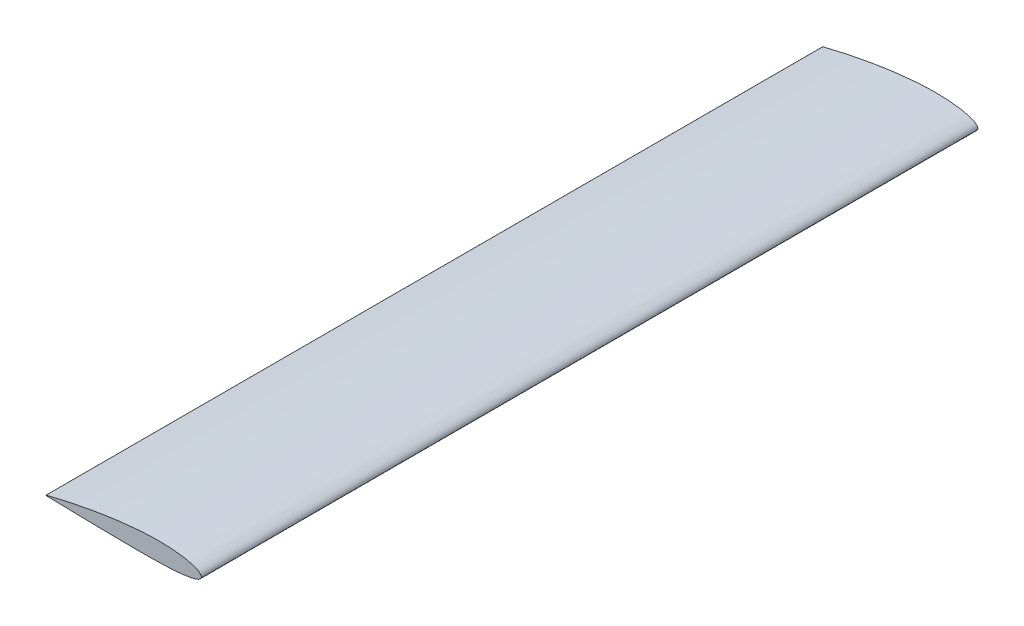
ISO-10303-21;
HEADER;
FILE_DESCRIPTION(('STEP AP214'),'2;1');
FILE_NAME('part.step','',(''),(''),'','','');
FILE_SCHEMA(('AUTOMOTIVE_DESIGN { 1 0 10303 214 1 1 1 1 }'));
ENDSEC;
DATA;
#1=APPLICATION_CONTEXT('core data for automotive mechanical design processes');
#2=APPLICATION_PROTOCOL_DEFINITION('international standard','automotive_design',2000,#1);
#3=PRODUCT_CONTEXT('',#1,'mechanical');
#4=PRODUCT('Part','Part','',(#3));
#5=PRODUCT_RELATED_PRODUCT_CATEGORY('part','',(#4));
#6=PRODUCT_DEFINITION_FORMATION('','',#4);
#7=PRODUCT_DEFINITION_CONTEXT('part definition',#1,'design');
#8=PRODUCT_DEFINITION('design','',#6,#7);
#9=PRODUCT_DEFINITION_SHAPE('','',#8);
#10=(LENGTH_UNIT() NAMED_UNIT(*) SI_UNIT(.MILLI.,.METRE.));
#11=(NAMED_UNIT(*) PLANE_ANGLE_UNIT() SI_UNIT($,.RADIAN.));
#12=(NAMED_UNIT(*) SI_UNIT($,.STERADIAN.) SOLID_ANGLE_UNIT());
#13=UNCERTAINTY_MEASURE_WITH_UNIT(LENGTH_MEASURE(1.E-05),#10,'distance_accuracy_value','');
#14=(GEOMETRIC_REPRESENTATION_CONTEXT(3) GLOBAL_UNCERTAINTY_ASSIGNED_CONTEXT((#13)) GLOBAL_UNIT_ASSIGNED_CONTEXT((#10,
#11,#12)) REPRESENTATION_CONTEXT('',''));
#15=CARTESIAN_POINT('',(0.,0.,0.));
#16=DIRECTION('',(0.,0.,1.));
#17=DIRECTION('',(1.,0.,0.));
#18=AXIS2_PLACEMENT_3D('',#15,#16,#17);
#19=CARTESIAN_POINT('',(-21.5149880919619,1.49289505253575,200.));
#20=CARTESIAN_POINT('',(-20.8552808528528,1.65836191019101,200.));
#21=CARTESIAN_POINT('',(-19.5375990437692,1.98886103982463,200.));
#22=CARTESIAN_POINT('',(-16.8979493866455,2.60408897384956,200.));
#23=CARTESIAN_POINT('',(-13.5935007095323,3.30234073325566,200.));
#24=CARTESIAN_POINT('',(-9.62153504880932,4.04911257775483,200.));
#25=CARTESIAN_POINT('',(-5.6460802092507,4.70083913196117,200.));
#26=CARTESIAN_POINT('',(-1.66331299768527,5.22484234700308,200.));
#27=CARTESIAN_POINT('',(2.32346877988122,5.63600355277235,200.));
#28=CARTESIAN_POINT('',(5.656633007237,5.82166566999899,200.));
#29=CARTESIAN_POINT('',(8.32675259810717,5.82769469753375,200.));
#30=CARTESIAN_POINT('',(10.3344227479367,5.75336243791782,200.));
#31=CARTESIAN_POINT('',(12.3487381124399,5.58478917604125,200.));
#32=CARTESIAN_POINT('',(14.0296115521638,5.34229294842828,200.));
#33=CARTESIAN_POINT('',(15.3742363976492,5.04362312569461,200.));
#34=CARTESIAN_POINT('',(16.3960036685772,4.76332551587091,200.));
#35=CARTESIAN_POINT('',(17.2661951421832,4.42275118989273,200.));
#36=CARTESIAN_POINT('',(18.0225851259267,3.99680442215517,200.));
#37=CARTESIAN_POINT('',(18.6993302032992,3.23262566509439,200.));
#38=CARTESIAN_POINT('',(18.062704035863,2.50715906463974,200.));
#39=CARTESIAN_POINT('',(17.3539555930788,2.15801290635164,200.));
#40=CARTESIAN_POINT('',(16.5145502138647,1.87965586102861,200.));
#41=CARTESIAN_POINT('',(15.5178113788948,1.66283214736944,200.));
#42=CARTESIAN_POINT('',(14.1898861783533,1.45695703477859,200.));
#43=CARTESIAN_POINT('',(12.5292288416715,1.27061703612148,200.));
#44=CARTESIAN_POINT('',(10.5312398266776,1.13774349447131,200.));
#45=CARTESIAN_POINT('',(8.53241217026352,1.05683280600654,200.));
#46=CARTESIAN_POINT('',(5.86546893621818,0.999315551548726,200.));
#47=CARTESIAN_POINT('',(2.53006814197317,0.959719147072521,200.));
#48=CARTESIAN_POINT('',(-1.47441513852983,0.969404554158539,200.));
#49=CARTESIAN_POINT('',(-5.4801499364741,1.03434695210018,200.));
#50=CARTESIAN_POINT('',(-9.48697437158574,1.10869611834631,200.));
#51=CARTESIAN_POINT('',(-13.4946147559285,1.18605498631132,200.));
#52=CARTESIAN_POINT('',(-16.8341832132715,1.27264683657346,200.));
#53=CARTESIAN_POINT('',(-19.5063687605127,1.33523150013912,200.));
#54=CARTESIAN_POINT('',(-20.842393454356,1.37107237127406,200.));
#55=CARTESIAN_POINT('',(-21.5104516756759,1.38899403749123,200.));
#56=B_SPLINE_CURVE_WITH_KNOTS('',3,(#19,#20,#21,#22,#23,#24,#25,#26,#27,#28,#29,#30,#31,#32,#33,
#34,#35,#36,#37,#38,#39,#40,#41,#42,#43,#44,#45,#46,#47,#48,#49,#50,#51,#52,#53,#54,#55),
.UNSPECIFIED.,.F.,.F.,(4,1,1,1,1,1,1,1,1,1,1,1,1,1,1,1,1,1,1,1,1,1,1,1,1,1,1,1,1,1,1,1,1,1,4),
(0.,0.0250124897498648,0.0499592861642578,0.0996729249269685,0.149206319909966,
0.198581096615965,0.247805170456832,0.296916574601493,0.345952721793533,0.37049162556991,
0.395091203654929,0.41981479582396,0.444798575016595,0.457489818915221,0.470406405435489,
0.483879408669829,0.491264120322896,0.503458853294664,0.513609129403887,0.520450990700287,
0.533235387615153,0.545691039147803,0.558031884237173,0.582609167247894,0.607134741746914,
0.631652079836766,0.656174271859652,0.705233949250519,0.754320378530032,0.803437363555032,
0.852566095729537,0.901700994033254,0.95084880933727,0.975422716989278,1.),.UNSPECIFIED.);
#57=DIRECTION('',(0.,0.,-1.));
#58=VECTOR('',#57,1.);
#59=SURFACE_OF_LINEAR_EXTRUSION('',#56,#58);
#60=CARTESIAN_POINT('',(-21.5149880919619,1.49289505253575,0.));
#61=CARTESIAN_POINT('',(-20.8552808528528,1.65836191019101,0.));
#62=CARTESIAN_POINT('',(-19.5375990437692,1.98886103982463,0.));
#63=CARTESIAN_POINT('',(-16.8979493866455,2.60408897384956,0.));
#64=CARTESIAN_POINT('',(-13.5935007095323,3.30234073325566,0.));
#65=CARTESIAN_POINT('',(-9.62153504880932,4.04911257775483,0.));
#66=CARTESIAN_POINT('',(-5.6460802092507,4.70083913196117,0.));
#67=CARTESIAN_POINT('',(-1.66331299768527,5.22484234700308,0.));
#68=CARTESIAN_POINT('',(2.32346877988122,5.63600355277235,0.));
#69=CARTESIAN_POINT('',(5.656633007237,5.82166566999899,0.));
#70=CARTESIAN_POINT('',(8.32675259810717,5.82769469753375,0.));
#71=CARTESIAN_POINT('',(10.3344227479367,5.75336243791782,0.));
#72=CARTESIAN_POINT('',(12.3487381124399,5.58478917604125,0.));
#73=CARTESIAN_POINT('',(14.0296115521638,5.34229294842828,0.));
#74=CARTESIAN_POINT('',(15.3742363976492,5.04362312569461,0.));
#75=CARTESIAN_POINT('',(16.3960036685772,4.76332551587091,0.));
#76=CARTESIAN_POINT('',(17.2661951421832,4.42275118989273,0.));
#77=CARTESIAN_POINT('',(18.0225851259267,3.99680442215517,0.));
#78=CARTESIAN_POINT('',(18.6993302032992,3.23262566509439,0.));
#79=CARTESIAN_POINT('',(18.062704035863,2.50715906463974,0.));
#80=CARTESIAN_POINT('',(17.3539555930788,2.15801290635164,0.));
#81=CARTESIAN_POINT('',(16.5145502138647,1.87965586102861,0.));
#82=CARTESIAN_POINT('',(15.5178113788948,1.66283214736944,0.));
#83=CARTESIAN_POINT('',(14.1898861783533,1.45695703477859,0.));
#84=CARTESIAN_POINT('',(12.5292288416715,1.27061703612148,0.));
#85=CARTESIAN_POINT('',(10.5312398266776,1.13774349447131,0.));
#86=CARTESIAN_POINT('',(8.53241217026352,1.05683280600654,0.));
#87=CARTESIAN_POINT('',(5.86546893621818,0.999315551548726,0.));
#88=CARTESIAN_POINT('',(2.53006814197317,0.959719147072521,0.));
#89=CARTESIAN_POINT('',(-1.47441513852983,0.969404554158539,0.));
#90=CARTESIAN_POINT('',(-5.4801499364741,1.03434695210018,0.));
#91=CARTESIAN_POINT('',(-9.48697437158574,1.10869611834631,0.));
#92=CARTESIAN_POINT('',(-13.4946147559285,1.18605498631132,0.));
#93=CARTESIAN_POINT('',(-16.8341832132715,1.27264683657346,0.));
#94=CARTESIAN_POINT('',(-19.5063687605127,1.33523150013912,0.));
#95=CARTESIAN_POINT('',(-20.842393454356,1.37107237127406,0.));
#96=CARTESIAN_POINT('',(-21.5104516756759,1.38899403749123,0.));
#97=B_SPLINE_CURVE_WITH_KNOTS('',3,(#60,#61,#62,#63,#64,#65,#66,#67,#68,#69,#70,#71,#72,#73,#74,
#75,#76,#77,#78,#79,#80,#81,#82,#83,#84,#85,#86,#87,#88,#89,#90,#91,#92,#93,#94,#95,#96),
.UNSPECIFIED.,.F.,.F.,(4,1,1,1,1,1,1,1,1,1,1,1,1,1,1,1,1,1,1,1,1,1,1,1,1,1,1,1,1,1,1,1,1,1,4),
(0.,0.0250124897498648,0.0499592861642578,0.0996729249269685,0.149206319909966,
0.198581096615965,0.247805170456832,0.296916574601493,0.345952721793533,0.37049162556991,
0.395091203654929,0.41981479582396,0.444798575016595,0.457489818915221,0.470406405435489,
0.483879408669829,0.491264120322896,0.503458853294664,0.513609129403887,0.520450990700287,
0.533235387615153,0.545691039147803,0.558031884237173,0.582609167247894,0.607134741746914,
0.631652079836766,0.656174271859652,0.705233949250519,0.754320378530032,0.803437363555032,
0.852566095729537,0.901700994033254,0.95084880933727,0.975422716989278,1.),.UNSPECIFIED.);
#98=CARTESIAN_POINT('',(-21.5149880919619,1.49289505253575,0.));
#99=VERTEX_POINT('',#98);
#100=CARTESIAN_POINT('',(-21.5104516756759,1.38899403749124,0.));
#101=VERTEX_POINT('',#100);
#102=EDGE_CURVE('E78',#99,#101,#97,.T.);
#103=ORIENTED_EDGE('',*,*,#102,.F.);
#104=DIRECTION('',(0.,0.,-1.));
#105=VECTOR('',#104,1.);
#106=CARTESIAN_POINT('',(-21.5149880919619,1.49289505253575,200.));
#107=LINE('',#106,#105);
#108=CARTESIAN_POINT('',(-21.5149880919619,1.49289505253575,200.));
#109=VERTEX_POINT('',#108);
#110=EDGE_CURVE('E11',#109,#99,#107,.T.);
#111=ORIENTED_EDGE('',*,*,#110,.F.);
#112=CARTESIAN_POINT('',(-21.5104516756759,1.38899403749124,200.));
#113=VERTEX_POINT('',#112);
#114=EDGE_CURVE('E80',#109,#113,#56,.T.);
#115=ORIENTED_EDGE('',*,*,#114,.T.);
#116=DIRECTION('',(0.,0.,-1.));
#117=VECTOR('',#116,1.);
#118=CARTESIAN_POINT('',(-21.5104516756759,1.38899403749124,200.));
#119=LINE('',#118,#117);
#120=EDGE_CURVE('E49',#113,#101,#119,.T.);
#121=ORIENTED_EDGE('',*,*,#120,.T.);
#122=EDGE_LOOP('',(#103,#111,#115,#121));
#123=FACE_BOUND('',#122,.T.);
#124=ADVANCED_FACE('F45',(#123),#59,.T.);
#125=CARTESIAN_POINT('',(-21.5018512212144,1.44141908107096,200.));
#126=DIRECTION('',(0.,0.,-1.));
#127=DIRECTION('',(-1.,0.,0.));
#128=AXIS2_PLACEMENT_3D('',#125,#126,#127);
#129=CYLINDRICAL_SURFACE('',#128,0.0531258224527436);
#130=CARTESIAN_POINT('',(-21.5018512212144,1.44141908107096,0.));
#131=DIRECTION('',(0.,0.,1.));
#132=DIRECTION('',(1.,0.,0.));
#133=AXIS2_PLACEMENT_3D('',#130,#131,#132);
#134=CIRCLE('',#133,0.0531258224527436);
#135=EDGE_CURVE('E72',#99,#101,#134,.T.);
#136=ORIENTED_EDGE('',*,*,#135,.T.);
#137=ORIENTED_EDGE('',*,*,#120,.F.);
#138=CARTESIAN_POINT('',(-21.5018512212144,1.44141908107096,200.));
#139=DIRECTION('',(0.,0.,1.));
#140=DIRECTION('',(1.,0.,0.));
#141=AXIS2_PLACEMENT_3D('',#138,#139,#140);
#142=CIRCLE('',#141,0.0531258224527436);
#143=EDGE_CURVE('E74',#109,#113,#142,.T.);
#144=ORIENTED_EDGE('',*,*,#143,.F.);
#145=ORIENTED_EDGE('',*,*,#110,.T.);
#146=EDGE_LOOP('',(#136,#137,#144,#145));
#147=FACE_BOUND('',#146,.T.);
#148=ADVANCED_FACE('F71',(#147),#129,.T.);
#149=CARTESIAN_POINT('',(18.4005844107726,3.44664979643489,200.));
#150=DIRECTION('',(0.,0.,1.));
#151=DIRECTION('',(1.,0.,0.));
#152=AXIS2_PLACEMENT_3D('',#149,#150,#151);
#153=PLANE('',#152);
#154=ORIENTED_EDGE('',*,*,#114,.F.);
#155=ORIENTED_EDGE('',*,*,#143,.T.);
#156=EDGE_LOOP('',(#154,#155));
#157=FACE_BOUND('',#156,.T.);
#158=ADVANCED_FACE('F99',(#157),#153,.T.);
#159=CARTESIAN_POINT('',(18.4005844107726,3.44664979643489,0.));
#160=DIRECTION('',(0.,0.,1.));
#161=DIRECTION('',(1.,0.,0.));
#162=AXIS2_PLACEMENT_3D('',#159,#160,#161);
#163=PLANE('',#162);
#164=ORIENTED_EDGE('',*,*,#102,.T.);
#165=ORIENTED_EDGE('',*,*,#135,.F.);
#166=EDGE_LOOP('',(#164,#165));
#167=FACE_BOUND('',#166,.T.);
#168=ADVANCED_FACE('F77',(#167),#163,.F.);
#169=CLOSED_SHELL('',(#124,#148,#158,#168));
#170=MANIFOLD_SOLID_BREP('B2',#169);
#171=ADVANCED_BREP_SHAPE_REPRESENTATION('',(#18,#170),#14);
#172=SHAPE_DEFINITION_REPRESENTATION(#9,#171);
ENDSEC;
END-ISO-10303-21;
